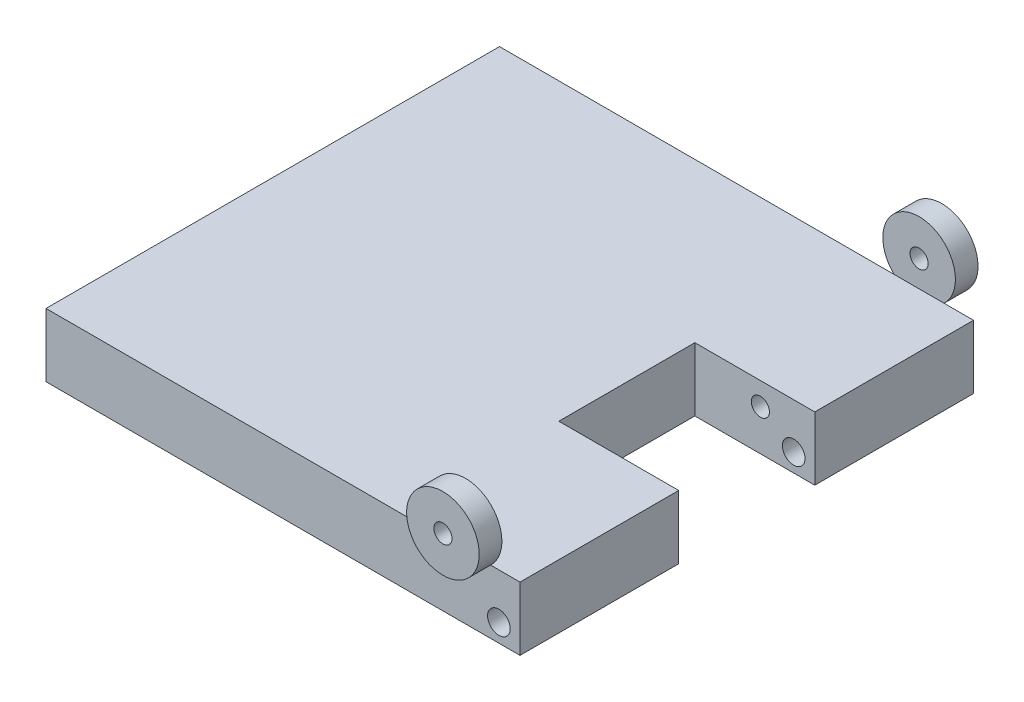
ISO-10303-21;
HEADER;
FILE_DESCRIPTION(('STEP AP214'),'2;1');
FILE_NAME('part.step','',(''),(''),'','','');
FILE_SCHEMA(('AUTOMOTIVE_DESIGN { 1 0 10303 214 1 1 1 1 }'));
ENDSEC;
DATA;
#1=APPLICATION_CONTEXT('core data for automotive mechanical design processes');
#2=APPLICATION_PROTOCOL_DEFINITION('international standard','automotive_design',2000,#1);
#3=PRODUCT_CONTEXT('',#1,'mechanical');
#4=PRODUCT('Part','Part','',(#3));
#5=PRODUCT_RELATED_PRODUCT_CATEGORY('part','',(#4));
#6=PRODUCT_DEFINITION_FORMATION('','',#4);
#7=PRODUCT_DEFINITION_CONTEXT('part definition',#1,'design');
#8=PRODUCT_DEFINITION('design','',#6,#7);
#9=PRODUCT_DEFINITION_SHAPE('','',#8);
#10=(LENGTH_UNIT() NAMED_UNIT(*) SI_UNIT(.MILLI.,.METRE.));
#11=(NAMED_UNIT(*) PLANE_ANGLE_UNIT() SI_UNIT($,.RADIAN.));
#12=(NAMED_UNIT(*) SI_UNIT($,.STERADIAN.) SOLID_ANGLE_UNIT());
#13=UNCERTAINTY_MEASURE_WITH_UNIT(LENGTH_MEASURE(1.E-05),#10,'distance_accuracy_value','');
#14=(GEOMETRIC_REPRESENTATION_CONTEXT(3) GLOBAL_UNCERTAINTY_ASSIGNED_CONTEXT((#13)) GLOBAL_UNIT_ASSIGNED_CONTEXT((#10,
#11,#12)) REPRESENTATION_CONTEXT('',''));
#15=CARTESIAN_POINT('',(0.,0.,0.));
#16=DIRECTION('',(0.,0.,1.));
#17=DIRECTION('',(1.,0.,0.));
#18=AXIS2_PLACEMENT_3D('',#15,#16,#17);
#19=CARTESIAN_POINT('',(0.,8.88999999999999,63.5));
#20=DIRECTION('',(-1.,0.,0.));
#21=DIRECTION('',(0.,0.,1.));
#22=AXIS2_PLACEMENT_3D('',#19,#20,#21);
#23=PLANE('',#22);
#24=DIRECTION('',(0.,0.,-1.));
#25=VECTOR('',#24,1.);
#26=CARTESIAN_POINT('',(0.,8.88999999999999,63.5));
#27=LINE('',#26,#25);
#28=CARTESIAN_POINT('',(0.,8.88999999999999,22.225));
#29=VERTEX_POINT('',#28);
#30=CARTESIAN_POINT('',(0.,8.88999999999999,0.));
#31=VERTEX_POINT('',#30);
#32=EDGE_CURVE('E49',#29,#31,#27,.T.);
#33=ORIENTED_EDGE('',*,*,#32,.F.);
#34=DIRECTION('',(0.,1.,0.));
#35=VECTOR('',#34,1.);
#36=CARTESIAN_POINT('',(0.,0.,22.225));
#37=LINE('',#36,#35);
#38=CARTESIAN_POINT('',(0.,0.,22.225));
#39=VERTEX_POINT('',#38);
#40=EDGE_CURVE('E191',#39,#29,#37,.T.);
#41=ORIENTED_EDGE('',*,*,#40,.F.);
#42=DIRECTION('',(0.,0.,-1.));
#43=VECTOR('',#42,1.);
#44=CARTESIAN_POINT('',(0.,0.,63.5));
#45=LINE('',#44,#43);
#46=CARTESIAN_POINT('',(0.,0.,0.));
#47=VERTEX_POINT('',#46);
#48=EDGE_CURVE('E245',#39,#47,#45,.T.);
#49=ORIENTED_EDGE('',*,*,#48,.T.);
#50=DIRECTION('',(0.,1.,0.));
#51=VECTOR('',#50,1.);
#52=CARTESIAN_POINT('',(0.,8.88999999999999,0.));
#53=LINE('',#52,#51);
#54=EDGE_CURVE('E138',#47,#31,#53,.T.);
#55=ORIENTED_EDGE('',*,*,#54,.T.);
#56=EDGE_LOOP('',(#33,#41,#49,#55));
#57=FACE_BOUND('',#56,.T.);
#58=ADVANCED_FACE('F39',(#57),#23,.F.);
#59=CARTESIAN_POINT('',(-2.95485645668282,2.53999999999999,63.5));
#60=DIRECTION('',(0.,0.,-1.));
#61=DIRECTION('',(-1.,0.,0.));
#62=AXIS2_PLACEMENT_3D('',#59,#60,#61);
#63=CYLINDRICAL_SURFACE('',#62,1.5875);
#64=CARTESIAN_POINT('',(-2.95485645668282,2.53999999999999,22.225));
#65=DIRECTION('',(0.,0.,-1.));
#66=DIRECTION('',(-1.,0.,0.));
#67=AXIS2_PLACEMENT_3D('',#64,#65,#66);
#68=CIRCLE('',#67,1.5875);
#69=CARTESIAN_POINT('',(-4.54235645668282,2.53999999999999,22.225));
#70=VERTEX_POINT('',#69);
#71=EDGE_CURVE('E43',#70,#70,#68,.T.);
#72=ORIENTED_EDGE('',*,*,#71,.F.);
#73=EDGE_LOOP('',(#72));
#74=FACE_BOUND('',#73,.T.);
#75=CARTESIAN_POINT('',(-2.95485645668282,2.53999999999999,0.));
#76=DIRECTION('',(0.,0.,1.));
#77=DIRECTION('',(1.,0.,0.));
#78=AXIS2_PLACEMENT_3D('',#75,#76,#77);
#79=CIRCLE('',#78,1.5875);
#80=CARTESIAN_POINT('',(-1.36735645668282,2.53999999999999,0.));
#81=VERTEX_POINT('',#80);
#82=EDGE_CURVE('E225',#81,#81,#79,.T.);
#83=ORIENTED_EDGE('',*,*,#82,.F.);
#84=EDGE_LOOP('',(#83));
#85=FACE_BOUND('',#84,.T.);
#86=ADVANCED_FACE('F276',(#74,#85),#63,.F.);
#87=CARTESIAN_POINT('',(0.,0.,63.5));
#88=DIRECTION('',(0.,0.,-1.));
#89=DIRECTION('',(-1.,0.,0.));
#90=AXIS2_PLACEMENT_3D('',#87,#88,#89);
#91=PLANE('',#90);
#92=CARTESIAN_POINT('',(-7.62,12.573,63.5));
#93=DIRECTION('',(0.,0.,1.));
#94=DIRECTION('',(1.,0.,0.));
#95=AXIS2_PLACEMENT_3D('',#92,#93,#94);
#96=CIRCLE('',#95,5.08);
#97=CARTESIAN_POINT('',(-11.1188442377448,8.88999999999999,63.5));
#98=VERTEX_POINT('',#97);
#99=CARTESIAN_POINT('',(-4.1211557622552,8.88999999999999,63.5));
#100=VERTEX_POINT('',#99);
#101=EDGE_CURVE('E65',#98,#100,#96,.T.);
#102=ORIENTED_EDGE('',*,*,#101,.F.);
#103=DIRECTION('',(-1.,0.,0.));
#104=VECTOR('',#103,1.);
#105=CARTESIAN_POINT('',(-66.3702,8.88999999999999,63.5));
#106=LINE('',#105,#104);
#107=CARTESIAN_POINT('',(-66.3702,8.88999999999999,63.5));
#108=VERTEX_POINT('',#107);
#109=EDGE_CURVE('E233',#98,#108,#106,.T.);
#110=ORIENTED_EDGE('',*,*,#109,.T.);
#111=DIRECTION('',(0.,-1.,0.));
#112=VECTOR('',#111,1.);
#113=CARTESIAN_POINT('',(-66.3702,0.,63.5));
#114=LINE('',#113,#112);
#115=CARTESIAN_POINT('',(-66.3702,0.,63.5));
#116=VERTEX_POINT('',#115);
#117=EDGE_CURVE('E238',#108,#116,#114,.T.);
#118=ORIENTED_EDGE('',*,*,#117,.T.);
#119=DIRECTION('',(1.,0.,0.));
#120=VECTOR('',#119,1.);
#121=CARTESIAN_POINT('',(0.,0.,63.5));
#122=LINE('',#121,#120);
#123=CARTESIAN_POINT('',(0.,0.,63.5));
#124=VERTEX_POINT('',#123);
#125=EDGE_CURVE('E242',#116,#124,#122,.T.);
#126=ORIENTED_EDGE('',*,*,#125,.T.);
#127=DIRECTION('',(0.,1.,0.));
#128=VECTOR('',#127,1.);
#129=CARTESIAN_POINT('',(0.,8.88999999999999,63.5));
#130=LINE('',#129,#128);
#131=CARTESIAN_POINT('',(0.,8.88999999999999,63.5));
#132=VERTEX_POINT('',#131);
#133=EDGE_CURVE('E229',#124,#132,#130,.T.);
#134=ORIENTED_EDGE('',*,*,#133,.T.);
#135=EDGE_CURVE('E235',#132,#100,#106,.T.);
#136=ORIENTED_EDGE('',*,*,#135,.T.);
#137=EDGE_LOOP('',(#102,#110,#118,#126,#134,#136));
#138=FACE_BOUND('',#137,.T.);
#139=CARTESIAN_POINT('',(-2.95485645668282,2.53999999999999,63.5));
#140=DIRECTION('',(0.,0.,1.));
#141=DIRECTION('',(1.,0.,0.));
#142=AXIS2_PLACEMENT_3D('',#139,#140,#141);
#143=CIRCLE('',#142,1.5875);
#144=CARTESIAN_POINT('',(-1.36735645668282,2.53999999999999,63.5));
#145=VERTEX_POINT('',#144);
#146=EDGE_CURVE('E221',#145,#145,#143,.T.);
#147=ORIENTED_EDGE('',*,*,#146,.F.);
#148=EDGE_LOOP('',(#147));
#149=FACE_BOUND('',#148,.T.);
#150=ADVANCED_FACE('F279',(#138,#149),#91,.F.);
#151=CARTESIAN_POINT('',(0.,0.,0.));
#152=DIRECTION('',(0.,0.,-1.));
#153=DIRECTION('',(-1.,0.,0.));
#154=AXIS2_PLACEMENT_3D('',#151,#152,#153);
#155=PLANE('',#154);
#156=CARTESIAN_POINT('',(-7.62,12.573,0.));
#157=DIRECTION('',(0.,0.,-1.));
#158=DIRECTION('',(-1.,0.,0.));
#159=AXIS2_PLACEMENT_3D('',#156,#157,#158);
#160=CIRCLE('',#159,5.08);
#161=CARTESIAN_POINT('',(-4.1211557622552,8.88999999999999,0.));
#162=VERTEX_POINT('',#161);
#163=CARTESIAN_POINT('',(-11.1188442377448,8.88999999999999,0.));
#164=VERTEX_POINT('',#163);
#165=EDGE_CURVE('E57',#162,#164,#160,.T.);
#166=ORIENTED_EDGE('',*,*,#165,.F.);
#167=DIRECTION('',(-1.,0.,0.));
#168=VECTOR('',#167,1.);
#169=CARTESIAN_POINT('',(-66.3702,8.88999999999999,0.));
#170=LINE('',#169,#168);
#171=EDGE_CURVE('E126',#31,#162,#170,.T.);
#172=ORIENTED_EDGE('',*,*,#171,.F.);
#173=ORIENTED_EDGE('',*,*,#54,.F.);
#174=DIRECTION('',(1.,0.,0.));
#175=VECTOR('',#174,1.);
#176=CARTESIAN_POINT('',(0.,0.,0.));
#177=LINE('',#176,#175);
#178=CARTESIAN_POINT('',(-66.3702,0.,0.));
#179=VERTEX_POINT('',#178);
#180=EDGE_CURVE('E234',#179,#47,#177,.T.);
#181=ORIENTED_EDGE('',*,*,#180,.F.);
#182=DIRECTION('',(0.,-1.,0.));
#183=VECTOR('',#182,1.);
#184=CARTESIAN_POINT('',(-66.3702,0.,0.));
#185=LINE('',#184,#183);
#186=CARTESIAN_POINT('',(-66.3702,8.88999999999999,0.));
#187=VERTEX_POINT('',#186);
#188=EDGE_CURVE('E136',#187,#179,#185,.T.);
#189=ORIENTED_EDGE('',*,*,#188,.F.);
#190=EDGE_CURVE('E124',#164,#187,#170,.T.);
#191=ORIENTED_EDGE('',*,*,#190,.F.);
#192=EDGE_LOOP('',(#166,#172,#173,#181,#189,#191));
#193=FACE_BOUND('',#192,.T.);
#194=ORIENTED_EDGE('',*,*,#82,.T.);
#195=EDGE_LOOP('',(#194));
#196=FACE_BOUND('',#195,.T.);
#197=ADVANCED_FACE('F133',(#193,#196),#155,.T.);
#198=CARTESIAN_POINT('',(0.,0.,41.275));
#199=VERTEX_POINT('',#198);
#200=EDGE_CURVE('E255',#124,#199,#45,.T.);
#201=ORIENTED_EDGE('',*,*,#200,.T.);
#202=DIRECTION('',(0.,-1.,0.));
#203=VECTOR('',#202,1.);
#204=CARTESIAN_POINT('',(0.,8.88999999999999,41.275));
#205=LINE('',#204,#203);
#206=CARTESIAN_POINT('',(0.,8.88999999999999,41.275));
#207=VERTEX_POINT('',#206);
#208=EDGE_CURVE('E182',#207,#199,#205,.T.);
#209=ORIENTED_EDGE('',*,*,#208,.F.);
#210=EDGE_CURVE('E11',#132,#207,#27,.T.);
#211=ORIENTED_EDGE('',*,*,#210,.F.);
#212=ORIENTED_EDGE('',*,*,#133,.F.);
#213=EDGE_LOOP('',(#201,#209,#211,#212));
#214=FACE_BOUND('',#213,.T.);
#215=ADVANCED_FACE('F41',(#214),#23,.F.);
#216=CARTESIAN_POINT('',(-66.3702,8.88999999999999,63.5));
#217=DIRECTION('',(0.,-1.,0.));
#218=DIRECTION('',(0.,0.,-1.));
#219=AXIS2_PLACEMENT_3D('',#216,#217,#218);
#220=PLANE('',#219);
#221=DIRECTION('',(0.,0.,1.));
#222=VECTOR('',#221,1.);
#223=CARTESIAN_POINT('',(-16.7894,8.88999999999999,31.75));
#224=LINE('',#223,#222);
#225=CARTESIAN_POINT('',(-16.7894,8.88999999999999,22.225));
#226=VERTEX_POINT('',#225);
#227=CARTESIAN_POINT('',(-16.7894,8.88999999999999,41.275));
#228=VERTEX_POINT('',#227);
#229=EDGE_CURVE('E186',#226,#228,#224,.T.);
#230=ORIENTED_EDGE('',*,*,#229,.F.);
#231=DIRECTION('',(1.,0.,0.));
#232=VECTOR('',#231,1.);
#233=CARTESIAN_POINT('',(-16.7894,8.88999999999999,22.225));
#234=LINE('',#233,#232);
#235=EDGE_CURVE('E207',#226,#29,#234,.T.);
#236=ORIENTED_EDGE('',*,*,#235,.T.);
#237=ORIENTED_EDGE('',*,*,#32,.T.);
#238=ORIENTED_EDGE('',*,*,#171,.T.);
#239=EDGE_CURVE('E120',#162,#164,#170,.T.);
#240=ORIENTED_EDGE('',*,*,#239,.T.);
#241=ORIENTED_EDGE('',*,*,#190,.T.);
#242=DIRECTION('',(0.,0.,-1.));
#243=VECTOR('',#242,1.);
#244=CARTESIAN_POINT('',(-66.3702,8.88999999999999,63.5));
#245=LINE('',#244,#243);
#246=EDGE_CURVE('E263',#108,#187,#245,.T.);
#247=ORIENTED_EDGE('',*,*,#246,.F.);
#248=ORIENTED_EDGE('',*,*,#109,.F.);
#249=EDGE_CURVE('E239',#100,#98,#106,.T.);
#250=ORIENTED_EDGE('',*,*,#249,.F.);
#251=ORIENTED_EDGE('',*,*,#135,.F.);
#252=ORIENTED_EDGE('',*,*,#210,.T.);
#253=DIRECTION('',(1.,0.,0.));
#254=VECTOR('',#253,1.);
#255=CARTESIAN_POINT('',(-16.7894,8.88999999999999,41.275));
#256=LINE('',#255,#254);
#257=EDGE_CURVE('E202',#228,#207,#256,.T.);
#258=ORIENTED_EDGE('',*,*,#257,.F.);
#259=EDGE_LOOP('',(#230,#236,#237,#238,#240,#241,#247,#248,#250,#251,#252,#258));
#260=FACE_BOUND('',#259,.T.);
#261=ADVANCED_FACE('F122',(#260),#220,.F.);
#262=CARTESIAN_POINT('',(-66.3702,0.,63.5));
#263=DIRECTION('',(1.,0.,0.));
#264=DIRECTION('',(0.,1.,0.));
#265=AXIS2_PLACEMENT_3D('',#262,#263,#264);
#266=PLANE('',#265);
#267=ORIENTED_EDGE('',*,*,#188,.T.);
#268=DIRECTION('',(0.,0.,-1.));
#269=VECTOR('',#268,1.);
#270=CARTESIAN_POINT('',(-66.3702,0.,63.5));
#271=LINE('',#270,#269);
#272=EDGE_CURVE('E259',#116,#179,#271,.T.);
#273=ORIENTED_EDGE('',*,*,#272,.F.);
#274=ORIENTED_EDGE('',*,*,#117,.F.);
#275=ORIENTED_EDGE('',*,*,#246,.T.);
#276=EDGE_LOOP('',(#267,#273,#274,#275));
#277=FACE_BOUND('',#276,.T.);
#278=ADVANCED_FACE('F310',(#277),#266,.F.);
#279=CARTESIAN_POINT('',(0.,0.,63.5));
#280=DIRECTION('',(0.,1.,0.));
#281=DIRECTION('',(-1.,0.,0.));
#282=AXIS2_PLACEMENT_3D('',#279,#280,#281);
#283=PLANE('',#282);
#284=ORIENTED_EDGE('',*,*,#48,.F.);
#285=DIRECTION('',(1.,0.,0.));
#286=VECTOR('',#285,1.);
#287=CARTESIAN_POINT('',(-16.7894,0.,22.225));
#288=LINE('',#287,#286);
#289=CARTESIAN_POINT('',(-16.7894,0.,22.225));
#290=VERTEX_POINT('',#289);
#291=EDGE_CURVE('E212',#290,#39,#288,.T.);
#292=ORIENTED_EDGE('',*,*,#291,.F.);
#293=DIRECTION('',(0.,0.,-1.));
#294=VECTOR('',#293,1.);
#295=CARTESIAN_POINT('',(-16.7894,0.,41.275));
#296=LINE('',#295,#294);
#297=CARTESIAN_POINT('',(-16.7894,0.,41.275));
#298=VERTEX_POINT('',#297);
#299=EDGE_CURVE('E194',#298,#290,#296,.T.);
#300=ORIENTED_EDGE('',*,*,#299,.F.);
#301=DIRECTION('',(1.,0.,0.));
#302=VECTOR('',#301,1.);
#303=CARTESIAN_POINT('',(-16.7894,0.,41.275));
#304=LINE('',#303,#302);
#305=EDGE_CURVE('E215',#298,#199,#304,.T.);
#306=ORIENTED_EDGE('',*,*,#305,.T.);
#307=ORIENTED_EDGE('',*,*,#200,.F.);
#308=ORIENTED_EDGE('',*,*,#125,.F.);
#309=ORIENTED_EDGE('',*,*,#272,.T.);
#310=ORIENTED_EDGE('',*,*,#180,.T.);
#311=EDGE_LOOP('',(#284,#292,#300,#306,#307,#308,#309,#310));
#312=FACE_BOUND('',#311,.T.);
#313=ADVANCED_FACE('F314',(#312),#283,.F.);
#314=CARTESIAN_POINT('',(-2.95485645668282,2.53999999999999,41.275));
#315=DIRECTION('',(0.,0.,1.));
#316=DIRECTION('',(1.,0.,0.));
#317=AXIS2_PLACEMENT_3D('',#314,#315,#316);
#318=CIRCLE('',#317,1.5875);
#319=CARTESIAN_POINT('',(-1.36735645668282,2.53999999999999,41.275));
#320=VERTEX_POINT('',#319);
#321=EDGE_CURVE('E211',#320,#320,#318,.T.);
#322=ORIENTED_EDGE('',*,*,#321,.F.);
#323=EDGE_LOOP('',(#322));
#324=FACE_BOUND('',#323,.T.);
#325=ORIENTED_EDGE('',*,*,#146,.T.);
#326=EDGE_LOOP('',(#325));
#327=FACE_BOUND('',#326,.T.);
#328=ADVANCED_FACE('F281',(#324,#327),#63,.F.);
#329=CARTESIAN_POINT('',(-16.7894,0.,22.225));
#330=DIRECTION('',(0.,0.,-1.));
#331=DIRECTION('',(-1.,0.,0.));
#332=AXIS2_PLACEMENT_3D('',#329,#330,#331);
#333=PLANE('',#332);
#334=CARTESIAN_POINT('',(-7.62,5.71499999999999,22.225));
#335=DIRECTION('',(0.,0.,1.));
#336=DIRECTION('',(1.,0.,0.));
#337=AXIS2_PLACEMENT_3D('',#334,#335,#336);
#338=CIRCLE('',#337,1.27);
#339=CARTESIAN_POINT('',(-6.35,5.71499999999999,22.225));
#340=VERTEX_POINT('',#339);
#341=EDGE_CURVE('E167',#340,#340,#338,.T.);
#342=ORIENTED_EDGE('',*,*,#341,.F.);
#343=EDGE_LOOP('',(#342));
#344=FACE_BOUND('',#343,.T.);
#345=ORIENTED_EDGE('',*,*,#71,.T.);
#346=EDGE_LOOP('',(#345));
#347=FACE_BOUND('',#346,.T.);
#348=ORIENTED_EDGE('',*,*,#40,.T.);
#349=ORIENTED_EDGE('',*,*,#235,.F.);
#350=DIRECTION('',(0.,1.,0.));
#351=VECTOR('',#350,1.);
#352=CARTESIAN_POINT('',(-16.7894,0.,22.225));
#353=LINE('',#352,#351);
#354=EDGE_CURVE('E198',#290,#226,#353,.T.);
#355=ORIENTED_EDGE('',*,*,#354,.F.);
#356=ORIENTED_EDGE('',*,*,#291,.T.);
#357=EDGE_LOOP('',(#348,#349,#355,#356));
#358=FACE_BOUND('',#357,.T.);
#359=ADVANCED_FACE('F273',(#344,#347,#358),#333,.F.);
#360=CARTESIAN_POINT('',(-16.7894,8.88999999999999,41.275));
#361=DIRECTION('',(0.,0.,1.));
#362=DIRECTION('',(1.,0.,0.));
#363=AXIS2_PLACEMENT_3D('',#360,#361,#362);
#364=PLANE('',#363);
#365=CARTESIAN_POINT('',(-7.62,5.71499999999999,41.275));
#366=DIRECTION('',(0.,0.,-1.));
#367=DIRECTION('',(-1.,0.,0.));
#368=AXIS2_PLACEMENT_3D('',#365,#366,#367);
#369=CIRCLE('',#368,1.27);
#370=CARTESIAN_POINT('',(-8.89,5.71499999999999,41.275));
#371=VERTEX_POINT('',#370);
#372=EDGE_CURVE('E174',#371,#371,#369,.T.);
#373=ORIENTED_EDGE('',*,*,#372,.F.);
#374=EDGE_LOOP('',(#373));
#375=FACE_BOUND('',#374,.T.);
#376=ORIENTED_EDGE('',*,*,#321,.T.);
#377=EDGE_LOOP('',(#376));
#378=FACE_BOUND('',#377,.T.);
#379=ORIENTED_EDGE('',*,*,#208,.T.);
#380=ORIENTED_EDGE('',*,*,#305,.F.);
#381=DIRECTION('',(0.,-1.,0.));
#382=VECTOR('',#381,1.);
#383=CARTESIAN_POINT('',(-16.7894,8.88999999999999,41.275));
#384=LINE('',#383,#382);
#385=EDGE_CURVE('E190',#228,#298,#384,.T.);
#386=ORIENTED_EDGE('',*,*,#385,.F.);
#387=ORIENTED_EDGE('',*,*,#257,.T.);
#388=EDGE_LOOP('',(#379,#380,#386,#387));
#389=FACE_BOUND('',#388,.T.);
#390=ADVANCED_FACE('F362',(#375,#378,#389),#364,.F.);
#391=CARTESIAN_POINT('',(-16.7894,0.,0.));
#392=DIRECTION('',(1.,0.,0.));
#393=DIRECTION('',(0.,0.,-1.));
#394=AXIS2_PLACEMENT_3D('',#391,#392,#393);
#395=PLANE('',#394);
#396=ORIENTED_EDGE('',*,*,#229,.T.);
#397=ORIENTED_EDGE('',*,*,#385,.T.);
#398=ORIENTED_EDGE('',*,*,#299,.T.);
#399=ORIENTED_EDGE('',*,*,#354,.T.);
#400=EDGE_LOOP('',(#396,#397,#398,#399));
#401=FACE_BOUND('',#400,.T.);
#402=ADVANCED_FACE('F358',(#401),#395,.T.);
#403=CARTESIAN_POINT('',(-7.62,5.71499999999999,53.975));
#404=DIRECTION('',(0.,0.,-1.));
#405=DIRECTION('',(-1.,0.,0.));
#406=AXIS2_PLACEMENT_3D('',#403,#404,#405);
#407=CYLINDRICAL_SURFACE('',#406,1.27);
#408=CARTESIAN_POINT('',(-7.62,5.71499999999999,53.975));
#409=DIRECTION('',(0.,0.,-1.));
#410=DIRECTION('',(-1.,0.,0.));
#411=AXIS2_PLACEMENT_3D('',#408,#409,#410);
#412=CIRCLE('',#411,1.27);
#413=CARTESIAN_POINT('',(-8.89,5.71499999999999,53.975));
#414=VERTEX_POINT('',#413);
#415=EDGE_CURVE('E178',#414,#414,#412,.T.);
#416=ORIENTED_EDGE('',*,*,#415,.F.);
#417=EDGE_LOOP('',(#416));
#418=FACE_BOUND('',#417,.T.);
#419=ORIENTED_EDGE('',*,*,#372,.T.);
#420=EDGE_LOOP('',(#419));
#421=FACE_BOUND('',#420,.T.);
#422=ADVANCED_FACE('F354',(#418,#421),#407,.F.);
#423=CARTESIAN_POINT('',(-7.62,5.71499999999999,53.975));
#424=DIRECTION('',(0.,0.,-1.));
#425=DIRECTION('',(-1.,0.,0.));
#426=AXIS2_PLACEMENT_3D('',#423,#424,#425);
#427=PLANE('',#426);
#428=ORIENTED_EDGE('',*,*,#415,.T.);
#429=EDGE_LOOP('',(#428));
#430=FACE_BOUND('',#429,.T.);
#431=ADVANCED_FACE('F350',(#430),#427,.T.);
#432=CARTESIAN_POINT('',(-7.62,5.71499999999999,9.525));
#433=DIRECTION('',(0.,0.,1.));
#434=DIRECTION('',(1.,0.,0.));
#435=AXIS2_PLACEMENT_3D('',#432,#433,#434);
#436=CYLINDRICAL_SURFACE('',#435,1.27);
#437=CARTESIAN_POINT('',(-7.62,5.71499999999999,9.525));
#438=DIRECTION('',(0.,0.,1.));
#439=DIRECTION('',(1.,0.,0.));
#440=AXIS2_PLACEMENT_3D('',#437,#438,#439);
#441=CIRCLE('',#440,1.27);
#442=CARTESIAN_POINT('',(-6.35,5.71499999999999,9.525));
#443=VERTEX_POINT('',#442);
#444=EDGE_CURVE('E170',#443,#443,#441,.T.);
#445=ORIENTED_EDGE('',*,*,#444,.F.);
#446=EDGE_LOOP('',(#445));
#447=FACE_BOUND('',#446,.T.);
#448=ORIENTED_EDGE('',*,*,#341,.T.);
#449=EDGE_LOOP('',(#448));
#450=FACE_BOUND('',#449,.T.);
#451=ADVANCED_FACE('F346',(#447,#450),#436,.F.);
#452=CARTESIAN_POINT('',(-7.62,5.71499999999999,9.525));
#453=DIRECTION('',(0.,0.,1.));
#454=DIRECTION('',(1.,0.,0.));
#455=AXIS2_PLACEMENT_3D('',#452,#453,#454);
#456=PLANE('',#455);
#457=ORIENTED_EDGE('',*,*,#444,.T.);
#458=EDGE_LOOP('',(#457));
#459=FACE_BOUND('',#458,.T.);
#460=ADVANCED_FACE('F343',(#459),#456,.T.);
#461=CARTESIAN_POINT('',(-7.62,12.573,63.5));
#462=DIRECTION('',(0.,0.,1.));
#463=DIRECTION('',(1.,0.,0.));
#464=AXIS2_PLACEMENT_3D('',#461,#462,#463);
#465=PLANE('',#464);
#466=CARTESIAN_POINT('',(-7.62,12.573,63.5));
#467=DIRECTION('',(0.,0.,1.));
#468=DIRECTION('',(1.,0.,0.));
#469=AXIS2_PLACEMENT_3D('',#466,#467,#468);
#470=CIRCLE('',#469,1.27);
#471=CARTESIAN_POINT('',(-6.35,12.573,63.5));
#472=VERTEX_POINT('',#471);
#473=EDGE_CURVE('E151',#472,#472,#470,.T.);
#474=ORIENTED_EDGE('',*,*,#473,.T.);
#475=EDGE_LOOP('',(#474));
#476=FACE_BOUND('',#475,.T.);
#477=EDGE_CURVE('E159',#100,#98,#96,.T.);
#478=ORIENTED_EDGE('',*,*,#477,.F.);
#479=ORIENTED_EDGE('',*,*,#249,.T.);
#480=EDGE_LOOP('',(#478,#479));
#481=FACE_BOUND('',#480,.T.);
#482=ADVANCED_FACE('F322',(#476,#481),#465,.F.);
#483=CARTESIAN_POINT('',(-7.62,12.573,66.675));
#484=DIRECTION('',(0.,0.,1.));
#485=DIRECTION('',(1.,0.,0.));
#486=AXIS2_PLACEMENT_3D('',#483,#484,#485);
#487=PLANE('',#486);
#488=CARTESIAN_POINT('',(-7.62,12.573,66.675));
#489=DIRECTION('',(0.,0.,1.));
#490=DIRECTION('',(1.,0.,0.));
#491=AXIS2_PLACEMENT_3D('',#488,#489,#490);
#492=CIRCLE('',#491,5.08);
#493=CARTESIAN_POINT('',(-2.54,12.573,66.675));
#494=VERTEX_POINT('',#493);
#495=EDGE_CURVE('E163',#494,#494,#492,.T.);
#496=ORIENTED_EDGE('',*,*,#495,.T.);
#497=EDGE_LOOP('',(#496));
#498=FACE_BOUND('',#497,.T.);
#499=CARTESIAN_POINT('',(-7.62,12.573,66.675));
#500=DIRECTION('',(0.,0.,1.));
#501=DIRECTION('',(1.,0.,0.));
#502=AXIS2_PLACEMENT_3D('',#499,#500,#501);
#503=CIRCLE('',#502,1.27);
#504=CARTESIAN_POINT('',(-6.35,12.573,66.675));
#505=VERTEX_POINT('',#504);
#506=EDGE_CURVE('E155',#505,#505,#503,.T.);
#507=ORIENTED_EDGE('',*,*,#506,.F.);
#508=EDGE_LOOP('',(#507));
#509=FACE_BOUND('',#508,.T.);
#510=ADVANCED_FACE('F328',(#498,#509),#487,.T.);
#511=CARTESIAN_POINT('',(-7.62,12.573,66.675));
#512=DIRECTION('',(0.,0.,-1.));
#513=DIRECTION('',(-1.,0.,0.));
#514=AXIS2_PLACEMENT_3D('',#511,#512,#513);
#515=CYLINDRICAL_SURFACE('',#514,5.08);
#516=ORIENTED_EDGE('',*,*,#495,.F.);
#517=EDGE_LOOP('',(#516));
#518=FACE_BOUND('',#517,.T.);
#519=ORIENTED_EDGE('',*,*,#101,.T.);
#520=ORIENTED_EDGE('',*,*,#477,.T.);
#521=EDGE_LOOP('',(#519,#520));
#522=FACE_BOUND('',#521,.T.);
#523=ADVANCED_FACE('F325',(#518,#522),#515,.T.);
#524=CARTESIAN_POINT('',(-7.62,12.573,66.675));
#525=DIRECTION('',(0.,0.,-1.));
#526=DIRECTION('',(-1.,0.,0.));
#527=AXIS2_PLACEMENT_3D('',#524,#525,#526);
#528=CYLINDRICAL_SURFACE('',#527,1.27);
#529=ORIENTED_EDGE('',*,*,#506,.T.);
#530=EDGE_LOOP('',(#529));
#531=FACE_BOUND('',#530,.T.);
#532=ORIENTED_EDGE('',*,*,#473,.F.);
#533=EDGE_LOOP('',(#532));
#534=FACE_BOUND('',#533,.T.);
#535=ADVANCED_FACE('F327',(#531,#534),#528,.F.);
#536=CARTESIAN_POINT('',(-7.62,12.573,-3.175));
#537=DIRECTION('',(0.,0.,-1.));
#538=DIRECTION('',(-1.,0.,0.));
#539=AXIS2_PLACEMENT_3D('',#536,#537,#538);
#540=PLANE('',#539);
#541=CARTESIAN_POINT('',(-7.62,12.573,-3.175));
#542=DIRECTION('',(0.,0.,-1.));
#543=DIRECTION('',(-1.,0.,0.));
#544=AXIS2_PLACEMENT_3D('',#541,#542,#543);
#545=CIRCLE('',#544,5.08);
#546=CARTESIAN_POINT('',(-12.7,12.573,-3.175));
#547=VERTEX_POINT('',#546);
#548=EDGE_CURVE('E148',#547,#547,#545,.T.);
#549=ORIENTED_EDGE('',*,*,#548,.T.);
#550=EDGE_LOOP('',(#549));
#551=FACE_BOUND('',#550,.T.);
#552=CARTESIAN_POINT('',(-7.62,12.573,-3.175));
#553=DIRECTION('',(0.,0.,-1.));
#554=DIRECTION('',(-1.,0.,0.));
#555=AXIS2_PLACEMENT_3D('',#552,#553,#554);
#556=CIRCLE('',#555,1.27);
#557=CARTESIAN_POINT('',(-8.89,12.573,-3.175));
#558=VERTEX_POINT('',#557);
#559=EDGE_CURVE('E144',#558,#558,#556,.T.);
#560=ORIENTED_EDGE('',*,*,#559,.F.);
#561=EDGE_LOOP('',(#560));
#562=FACE_BOUND('',#561,.T.);
#563=ADVANCED_FACE('F335',(#551,#562),#540,.T.);
#564=CARTESIAN_POINT('',(-7.62,12.573,0.));
#565=DIRECTION('',(0.,0.,-1.));
#566=DIRECTION('',(-1.,0.,0.));
#567=AXIS2_PLACEMENT_3D('',#564,#565,#566);
#568=PLANE('',#567);
#569=ORIENTED_EDGE('',*,*,#239,.F.);
#570=EDGE_CURVE('E139',#164,#162,#160,.T.);
#571=ORIENTED_EDGE('',*,*,#570,.F.);
#572=EDGE_LOOP('',(#569,#571));
#573=FACE_BOUND('',#572,.T.);
#574=CARTESIAN_POINT('',(-7.62,12.573,0.));
#575=DIRECTION('',(0.,0.,-1.));
#576=DIRECTION('',(-1.,0.,0.));
#577=AXIS2_PLACEMENT_3D('',#574,#575,#576);
#578=CIRCLE('',#577,1.27);
#579=CARTESIAN_POINT('',(-8.89,12.573,0.));
#580=VERTEX_POINT('',#579);
#581=EDGE_CURVE('E532',#580,#580,#578,.T.);
#582=ORIENTED_EDGE('',*,*,#581,.T.);
#583=EDGE_LOOP('',(#582));
#584=FACE_BOUND('',#583,.T.);
#585=ADVANCED_FACE('F140',(#573,#584),#568,.F.);
#586=CARTESIAN_POINT('',(-7.62,12.573,-3.175));
#587=DIRECTION('',(0.,0.,1.));
#588=DIRECTION('',(1.,0.,0.));
#589=AXIS2_PLACEMENT_3D('',#586,#587,#588);
#590=CYLINDRICAL_SURFACE('',#589,5.08);
#591=ORIENTED_EDGE('',*,*,#548,.F.);
#592=EDGE_LOOP('',(#591));
#593=FACE_BOUND('',#592,.T.);
#594=ORIENTED_EDGE('',*,*,#165,.T.);
#595=ORIENTED_EDGE('',*,*,#570,.T.);
#596=EDGE_LOOP('',(#594,#595));
#597=FACE_BOUND('',#596,.T.);
#598=ADVANCED_FACE('F146',(#593,#597),#590,.T.);
#599=CARTESIAN_POINT('',(-7.62,12.573,-3.175));
#600=DIRECTION('',(0.,0.,1.));
#601=DIRECTION('',(1.,0.,0.));
#602=AXIS2_PLACEMENT_3D('',#599,#600,#601);
#603=CYLINDRICAL_SURFACE('',#602,1.27);
#604=ORIENTED_EDGE('',*,*,#559,.T.);
#605=EDGE_LOOP('',(#604));
#606=FACE_BOUND('',#605,.T.);
#607=ORIENTED_EDGE('',*,*,#581,.F.);
#608=EDGE_LOOP('',(#607));
#609=FACE_BOUND('',#608,.T.);
#610=ADVANCED_FACE('F508',(#606,#609),#603,.F.);
#611=CLOSED_SHELL('',(#58,#86,#150,#197,#215,#261,#278,#313,#328,#359,#390,#402,#422,#431,#451,
#460,#482,#510,#523,#535,#563,#585,#598,#610));
#612=MANIFOLD_SOLID_BREP('B2',#611);
#613=ADVANCED_BREP_SHAPE_REPRESENTATION('',(#18,#612),#14);
#614=SHAPE_DEFINITION_REPRESENTATION(#9,#613);
ENDSEC;
END-ISO-10303-21;
